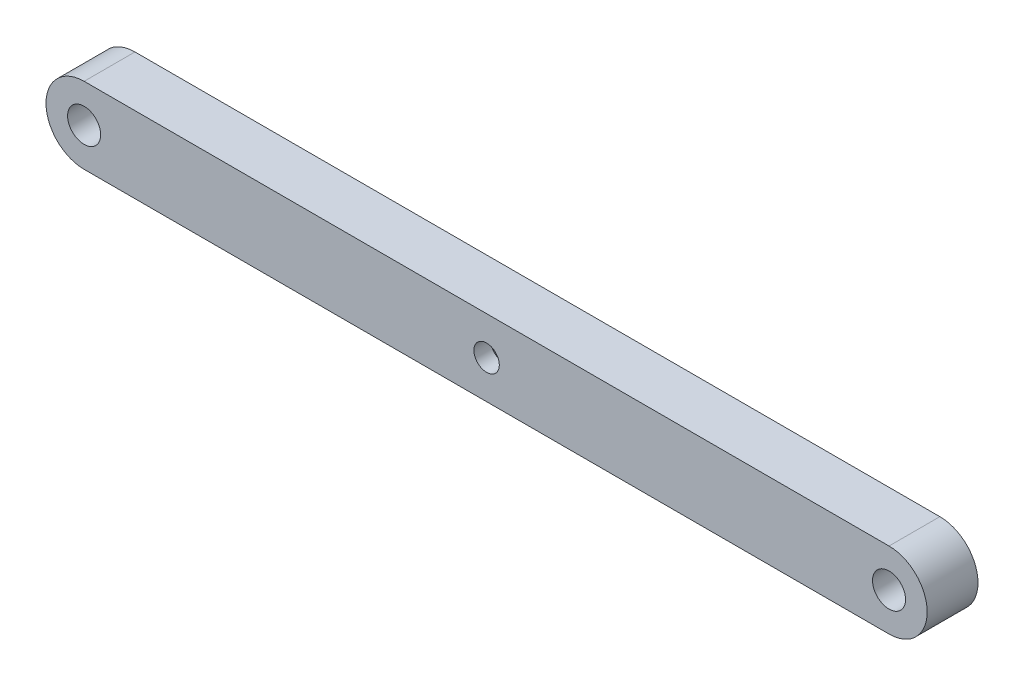
ISO-10303-21;
HEADER;
FILE_DESCRIPTION(('STEP AP214'),'2;1');
FILE_NAME('part.step','',(''),(''),'','','');
FILE_SCHEMA(('AUTOMOTIVE_DESIGN { 1 0 10303 214 1 1 1 1 }'));
ENDSEC;
DATA;
#1=APPLICATION_CONTEXT('core data for automotive mechanical design processes');
#2=APPLICATION_PROTOCOL_DEFINITION('international standard','automotive_design',2000,#1);
#3=PRODUCT_CONTEXT('',#1,'mechanical');
#4=PRODUCT('Part','Part','',(#3));
#5=PRODUCT_RELATED_PRODUCT_CATEGORY('part','',(#4));
#6=PRODUCT_DEFINITION_FORMATION('','',#4);
#7=PRODUCT_DEFINITION_CONTEXT('part definition',#1,'design');
#8=PRODUCT_DEFINITION('design','',#6,#7);
#9=PRODUCT_DEFINITION_SHAPE('','',#8);
#10=(LENGTH_UNIT() NAMED_UNIT(*) SI_UNIT(.MILLI.,.METRE.));
#11=(NAMED_UNIT(*) PLANE_ANGLE_UNIT() SI_UNIT($,.RADIAN.));
#12=(NAMED_UNIT(*) SI_UNIT($,.STERADIAN.) SOLID_ANGLE_UNIT());
#13=UNCERTAINTY_MEASURE_WITH_UNIT(LENGTH_MEASURE(1.E-05),#10,'distance_accuracy_value','');
#14=(GEOMETRIC_REPRESENTATION_CONTEXT(3) GLOBAL_UNCERTAINTY_ASSIGNED_CONTEXT((#13)) GLOBAL_UNIT_ASSIGNED_CONTEXT((#10,
#11,#12)) REPRESENTATION_CONTEXT('',''));
#15=CARTESIAN_POINT('',(0.,0.,0.));
#16=DIRECTION('',(0.,0.,1.));
#17=DIRECTION('',(1.,0.,0.));
#18=AXIS2_PLACEMENT_3D('',#15,#16,#17);
#19=CARTESIAN_POINT('',(47.5,0.,0.));
#20=DIRECTION('',(0.,0.,1.));
#21=DIRECTION('',(1.,0.,0.));
#22=AXIS2_PLACEMENT_3D('',#19,#20,#21);
#23=CYLINDRICAL_SURFACE('',#22,4.5);
#24=CARTESIAN_POINT('',(47.5,0.,6.));
#25=DIRECTION('',(0.,0.,1.));
#26=DIRECTION('',(1.,0.,0.));
#27=AXIS2_PLACEMENT_3D('',#24,#25,#26);
#28=CIRCLE('',#27,4.5);
#29=CARTESIAN_POINT('',(47.5,-4.5,6.));
#30=VERTEX_POINT('',#29);
#31=CARTESIAN_POINT('',(47.5,4.5,6.));
#32=VERTEX_POINT('',#31);
#33=EDGE_CURVE('E113',#30,#32,#28,.T.);
#34=ORIENTED_EDGE('',*,*,#33,.F.);
#35=DIRECTION('',(0.,0.,1.));
#36=VECTOR('',#35,1.);
#37=CARTESIAN_POINT('',(47.5,-4.5,0.));
#38=LINE('',#37,#36);
#39=CARTESIAN_POINT('',(47.5,-4.5,0.));
#40=VERTEX_POINT('',#39);
#41=EDGE_CURVE('E11',#40,#30,#38,.T.);
#42=ORIENTED_EDGE('',*,*,#41,.F.);
#43=CARTESIAN_POINT('',(47.5,0.,0.));
#44=DIRECTION('',(0.,0.,1.));
#45=DIRECTION('',(1.,0.,0.));
#46=AXIS2_PLACEMENT_3D('',#43,#44,#45);
#47=CIRCLE('',#46,4.5);
#48=CARTESIAN_POINT('',(47.5,4.5,0.));
#49=VERTEX_POINT('',#48);
#50=EDGE_CURVE('E104',#40,#49,#47,.T.);
#51=ORIENTED_EDGE('',*,*,#50,.T.);
#52=DIRECTION('',(0.,0.,1.));
#53=VECTOR('',#52,1.);
#54=CARTESIAN_POINT('',(47.5,4.5,0.));
#55=LINE('',#54,#53);
#56=EDGE_CURVE('E45',#49,#32,#55,.T.);
#57=ORIENTED_EDGE('',*,*,#56,.T.);
#58=EDGE_LOOP('',(#34,#42,#51,#57));
#59=FACE_BOUND('',#58,.T.);
#60=ADVANCED_FACE('F42',(#59),#23,.T.);
#61=CARTESIAN_POINT('',(-47.5,-4.5,0.));
#62=DIRECTION('',(0.,-1.,0.));
#63=DIRECTION('',(0.,0.,-1.));
#64=AXIS2_PLACEMENT_3D('',#61,#62,#63);
#65=PLANE('',#64);
#66=DIRECTION('',(1.,0.,0.));
#67=VECTOR('',#66,1.);
#68=CARTESIAN_POINT('',(-47.5,-4.5,6.));
#69=LINE('',#68,#67);
#70=CARTESIAN_POINT('',(-47.5,-4.5,6.));
#71=VERTEX_POINT('',#70);
#72=EDGE_CURVE('E107',#71,#30,#69,.T.);
#73=ORIENTED_EDGE('',*,*,#72,.F.);
#74=DIRECTION('',(0.,0.,1.));
#75=VECTOR('',#74,1.);
#76=CARTESIAN_POINT('',(-47.5,-4.5,0.));
#77=LINE('',#76,#75);
#78=CARTESIAN_POINT('',(-47.5,-4.5,0.));
#79=VERTEX_POINT('',#78);
#80=EDGE_CURVE('E52',#79,#71,#77,.T.);
#81=ORIENTED_EDGE('',*,*,#80,.F.);
#82=DIRECTION('',(1.,0.,0.));
#83=VECTOR('',#82,1.);
#84=CARTESIAN_POINT('',(-47.5,-4.5,0.));
#85=LINE('',#84,#83);
#86=EDGE_CURVE('E99',#79,#40,#85,.T.);
#87=ORIENTED_EDGE('',*,*,#86,.T.);
#88=ORIENTED_EDGE('',*,*,#41,.T.);
#89=EDGE_LOOP('',(#73,#81,#87,#88));
#90=FACE_BOUND('',#89,.T.);
#91=ADVANCED_FACE('F130',(#90),#65,.T.);
#92=CARTESIAN_POINT('',(-47.5,0.,0.));
#93=DIRECTION('',(0.,0.,1.));
#94=DIRECTION('',(1.,0.,0.));
#95=AXIS2_PLACEMENT_3D('',#92,#93,#94);
#96=CYLINDRICAL_SURFACE('',#95,4.5);
#97=CARTESIAN_POINT('',(-47.5,0.,6.));
#98=DIRECTION('',(0.,0.,1.));
#99=DIRECTION('',(1.,0.,0.));
#100=AXIS2_PLACEMENT_3D('',#97,#98,#99);
#101=CIRCLE('',#100,4.5);
#102=CARTESIAN_POINT('',(-47.5,4.5,6.));
#103=VERTEX_POINT('',#102);
#104=EDGE_CURVE('E93',#103,#71,#101,.T.);
#105=ORIENTED_EDGE('',*,*,#104,.F.);
#106=DIRECTION('',(0.,0.,1.));
#107=VECTOR('',#106,1.);
#108=CARTESIAN_POINT('',(-47.5,4.5,0.));
#109=LINE('',#108,#107);
#110=CARTESIAN_POINT('',(-47.5,4.5,0.));
#111=VERTEX_POINT('',#110);
#112=EDGE_CURVE('E88',#111,#103,#109,.T.);
#113=ORIENTED_EDGE('',*,*,#112,.F.);
#114=CARTESIAN_POINT('',(-47.5,0.,0.));
#115=DIRECTION('',(0.,0.,1.));
#116=DIRECTION('',(1.,0.,0.));
#117=AXIS2_PLACEMENT_3D('',#114,#115,#116);
#118=CIRCLE('',#117,4.5);
#119=EDGE_CURVE('E91',#111,#79,#118,.T.);
#120=ORIENTED_EDGE('',*,*,#119,.T.);
#121=ORIENTED_EDGE('',*,*,#80,.T.);
#122=EDGE_LOOP('',(#105,#113,#120,#121));
#123=FACE_BOUND('',#122,.T.);
#124=ADVANCED_FACE('F90',(#123),#96,.T.);
#125=CARTESIAN_POINT('',(47.5,4.5,0.));
#126=DIRECTION('',(0.,1.,0.));
#127=DIRECTION('',(0.,0.,1.));
#128=AXIS2_PLACEMENT_3D('',#125,#126,#127);
#129=PLANE('',#128);
#130=DIRECTION('',(-1.,0.,0.));
#131=VECTOR('',#130,1.);
#132=CARTESIAN_POINT('',(47.5,4.5,6.));
#133=LINE('',#132,#131);
#134=EDGE_CURVE('E117',#32,#103,#133,.T.);
#135=ORIENTED_EDGE('',*,*,#134,.F.);
#136=ORIENTED_EDGE('',*,*,#56,.F.);
#137=DIRECTION('',(-1.,0.,0.));
#138=VECTOR('',#137,1.);
#139=CARTESIAN_POINT('',(47.5,4.5,0.));
#140=LINE('',#139,#138);
#141=EDGE_CURVE('E98',#49,#111,#140,.T.);
#142=ORIENTED_EDGE('',*,*,#141,.T.);
#143=ORIENTED_EDGE('',*,*,#112,.T.);
#144=EDGE_LOOP('',(#135,#136,#142,#143));
#145=FACE_BOUND('',#144,.T.);
#146=ADVANCED_FACE('F102',(#145),#129,.T.);
#147=CARTESIAN_POINT('',(47.5,0.,0.));
#148=DIRECTION('',(0.,0.,1.));
#149=DIRECTION('',(1.,0.,0.));
#150=AXIS2_PLACEMENT_3D('',#147,#148,#149);
#151=PLANE('',#150);
#152=CARTESIAN_POINT('',(0.,0.,0.));
#153=DIRECTION('',(0.,0.,-1.));
#154=DIRECTION('',(-1.,0.,0.));
#155=AXIS2_PLACEMENT_3D('',#152,#153,#154);
#156=CIRCLE('',#155,2.5);
#157=CARTESIAN_POINT('',(-2.5,0.,0.));
#158=VERTEX_POINT('',#157);
#159=EDGE_CURVE('E178',#158,#158,#156,.T.);
#160=ORIENTED_EDGE('',*,*,#159,.F.);
#161=EDGE_LOOP('',(#160));
#162=FACE_BOUND('',#161,.T.);
#163=CARTESIAN_POINT('',(-47.5,0.,0.));
#164=DIRECTION('',(0.,0.,-1.));
#165=DIRECTION('',(-1.,0.,0.));
#166=AXIS2_PLACEMENT_3D('',#163,#164,#165);
#167=CIRCLE('',#166,1.94999999999999);
#168=CARTESIAN_POINT('',(-49.45,0.,0.));
#169=VERTEX_POINT('',#168);
#170=EDGE_CURVE('E192',#169,#169,#167,.T.);
#171=ORIENTED_EDGE('',*,*,#170,.F.);
#172=EDGE_LOOP('',(#171));
#173=FACE_BOUND('',#172,.T.);
#174=CARTESIAN_POINT('',(47.5,0.,0.));
#175=DIRECTION('',(0.,0.,-1.));
#176=DIRECTION('',(-1.,0.,0.));
#177=AXIS2_PLACEMENT_3D('',#174,#175,#176);
#178=CIRCLE('',#177,1.94999999999999);
#179=CARTESIAN_POINT('',(45.55,0.,0.));
#180=VERTEX_POINT('',#179);
#181=EDGE_CURVE('E200',#180,#180,#178,.T.);
#182=ORIENTED_EDGE('',*,*,#181,.F.);
#183=EDGE_LOOP('',(#182));
#184=FACE_BOUND('',#183,.T.);
#185=ORIENTED_EDGE('',*,*,#50,.F.);
#186=ORIENTED_EDGE('',*,*,#86,.F.);
#187=ORIENTED_EDGE('',*,*,#119,.F.);
#188=ORIENTED_EDGE('',*,*,#141,.F.);
#189=EDGE_LOOP('',(#185,#186,#187,#188));
#190=FACE_BOUND('',#189,.T.);
#191=ADVANCED_FACE('F97',(#162,#173,#184,#190),#151,.F.);
#192=CARTESIAN_POINT('',(47.5,0.,6.));
#193=DIRECTION('',(0.,0.,1.));
#194=DIRECTION('',(1.,0.,0.));
#195=AXIS2_PLACEMENT_3D('',#192,#193,#194);
#196=PLANE('',#195);
#197=CARTESIAN_POINT('',(0.,0.,6.00000000000001));
#198=DIRECTION('',(0.,0.,-1.));
#199=DIRECTION('',(-1.,0.,0.));
#200=AXIS2_PLACEMENT_3D('',#197,#198,#199);
#201=CIRCLE('',#200,1.50000000000001);
#202=CARTESIAN_POINT('',(-1.50000000000001,0.,6.00000000000001));
#203=VERTEX_POINT('',#202);
#204=EDGE_CURVE('E188',#203,#203,#201,.T.);
#205=ORIENTED_EDGE('',*,*,#204,.T.);
#206=EDGE_LOOP('',(#205));
#207=FACE_BOUND('',#206,.T.);
#208=CARTESIAN_POINT('',(-47.5,0.,6.00000000000001));
#209=DIRECTION('',(0.,0.,-1.));
#210=DIRECTION('',(-1.,0.,0.));
#211=AXIS2_PLACEMENT_3D('',#208,#209,#210);
#212=CIRCLE('',#211,1.94999999999999);
#213=CARTESIAN_POINT('',(-49.45,0.,6.00000000000001));
#214=VERTEX_POINT('',#213);
#215=EDGE_CURVE('E196',#214,#214,#212,.T.);
#216=ORIENTED_EDGE('',*,*,#215,.T.);
#217=EDGE_LOOP('',(#216));
#218=FACE_BOUND('',#217,.T.);
#219=CARTESIAN_POINT('',(47.5,0.,6.00000000000001));
#220=DIRECTION('',(0.,0.,-1.));
#221=DIRECTION('',(-1.,0.,0.));
#222=AXIS2_PLACEMENT_3D('',#219,#220,#221);
#223=CIRCLE('',#222,1.94999999999999);
#224=CARTESIAN_POINT('',(45.55,0.,6.00000000000001));
#225=VERTEX_POINT('',#224);
#226=EDGE_CURVE('E118',#225,#225,#223,.T.);
#227=ORIENTED_EDGE('',*,*,#226,.T.);
#228=EDGE_LOOP('',(#227));
#229=FACE_BOUND('',#228,.T.);
#230=ORIENTED_EDGE('',*,*,#33,.T.);
#231=ORIENTED_EDGE('',*,*,#134,.T.);
#232=ORIENTED_EDGE('',*,*,#104,.T.);
#233=ORIENTED_EDGE('',*,*,#72,.T.);
#234=EDGE_LOOP('',(#230,#231,#232,#233));
#235=FACE_BOUND('',#234,.T.);
#236=ADVANCED_FACE('F129',(#207,#218,#229,#235),#196,.T.);
#237=CARTESIAN_POINT('',(47.5,0.,0.));
#238=DIRECTION('',(0.,0.,-1.));
#239=DIRECTION('',(-1.,0.,0.));
#240=AXIS2_PLACEMENT_3D('',#237,#238,#239);
#241=CYLINDRICAL_SURFACE('',#240,1.94999999999999);
#242=ORIENTED_EDGE('',*,*,#226,.F.);
#243=EDGE_LOOP('',(#242));
#244=FACE_BOUND('',#243,.T.);
#245=ORIENTED_EDGE('',*,*,#181,.T.);
#246=EDGE_LOOP('',(#245));
#247=FACE_BOUND('',#246,.T.);
#248=ADVANCED_FACE('F148',(#244,#247),#241,.F.);
#249=CARTESIAN_POINT('',(-47.5,0.,0.));
#250=DIRECTION('',(0.,0.,-1.));
#251=DIRECTION('',(-1.,0.,0.));
#252=AXIS2_PLACEMENT_3D('',#249,#250,#251);
#253=CYLINDRICAL_SURFACE('',#252,1.94999999999999);
#254=ORIENTED_EDGE('',*,*,#215,.F.);
#255=EDGE_LOOP('',(#254));
#256=FACE_BOUND('',#255,.T.);
#257=ORIENTED_EDGE('',*,*,#170,.T.);
#258=EDGE_LOOP('',(#257));
#259=FACE_BOUND('',#258,.T.);
#260=ADVANCED_FACE('F155',(#256,#259),#253,.F.);
#261=CARTESIAN_POINT('',(0.,0.,0.));
#262=DIRECTION('',(0.,0.,-1.));
#263=DIRECTION('',(-1.,0.,0.));
#264=AXIS2_PLACEMENT_3D('',#261,#262,#263);
#265=CYLINDRICAL_SURFACE('',#264,1.50000000000001);
#266=ORIENTED_EDGE('',*,*,#204,.F.);
#267=EDGE_LOOP('',(#266));
#268=FACE_BOUND('',#267,.T.);
#269=CARTESIAN_POINT('',(0.,0.,3.99999999999999));
#270=DIRECTION('',(0.,0.,-1.));
#271=DIRECTION('',(-1.,0.,0.));
#272=AXIS2_PLACEMENT_3D('',#269,#270,#271);
#273=CIRCLE('',#272,1.50000000000001);
#274=CARTESIAN_POINT('',(-1.50000000000001,0.,3.99999999999999));
#275=VERTEX_POINT('',#274);
#276=EDGE_CURVE('E182',#275,#275,#273,.T.);
#277=ORIENTED_EDGE('',*,*,#276,.T.);
#278=EDGE_LOOP('',(#277));
#279=FACE_BOUND('',#278,.T.);
#280=ADVANCED_FACE('F159',(#268,#279),#265,.F.);
#281=CARTESIAN_POINT('',(0.,0.,3.));
#282=DIRECTION('',(0.,0.,-1.));
#283=DIRECTION('',(-1.,0.,0.));
#284=AXIS2_PLACEMENT_3D('',#281,#282,#283);
#285=CONICAL_SURFACE('',#284,2.5,0.785398163397446);
#286=ORIENTED_EDGE('',*,*,#276,.F.);
#287=EDGE_LOOP('',(#286));
#288=FACE_BOUND('',#287,.T.);
#289=CARTESIAN_POINT('',(0.,0.,3.));
#290=DIRECTION('',(0.,0.,-1.));
#291=DIRECTION('',(-1.,0.,0.));
#292=AXIS2_PLACEMENT_3D('',#289,#290,#291);
#293=CIRCLE('',#292,2.5);
#294=CARTESIAN_POINT('',(-2.5,0.,3.));
#295=VERTEX_POINT('',#294);
#296=EDGE_CURVE('E176',#295,#295,#293,.T.);
#297=ORIENTED_EDGE('',*,*,#296,.T.);
#298=EDGE_LOOP('',(#297));
#299=FACE_BOUND('',#298,.T.);
#300=ADVANCED_FACE('F163',(#288,#299),#285,.F.);
#301=CARTESIAN_POINT('',(0.,0.,0.));
#302=DIRECTION('',(0.,0.,-1.));
#303=DIRECTION('',(-1.,0.,0.));
#304=AXIS2_PLACEMENT_3D('',#301,#302,#303);
#305=CYLINDRICAL_SURFACE('',#304,2.5);
#306=ORIENTED_EDGE('',*,*,#296,.F.);
#307=EDGE_LOOP('',(#306));
#308=FACE_BOUND('',#307,.T.);
#309=ORIENTED_EDGE('',*,*,#159,.T.);
#310=EDGE_LOOP('',(#309));
#311=FACE_BOUND('',#310,.T.);
#312=ADVANCED_FACE('F167',(#308,#311),#305,.F.);
#313=CLOSED_SHELL('',(#60,#91,#124,#146,#191,#236,#248,#260,#280,#300,#312));
#314=MANIFOLD_SOLID_BREP('B2',#313);
#315=ADVANCED_BREP_SHAPE_REPRESENTATION('',(#18,#314),#14);
#316=SHAPE_DEFINITION_REPRESENTATION(#9,#315);
ENDSEC;
END-ISO-10303-21;
